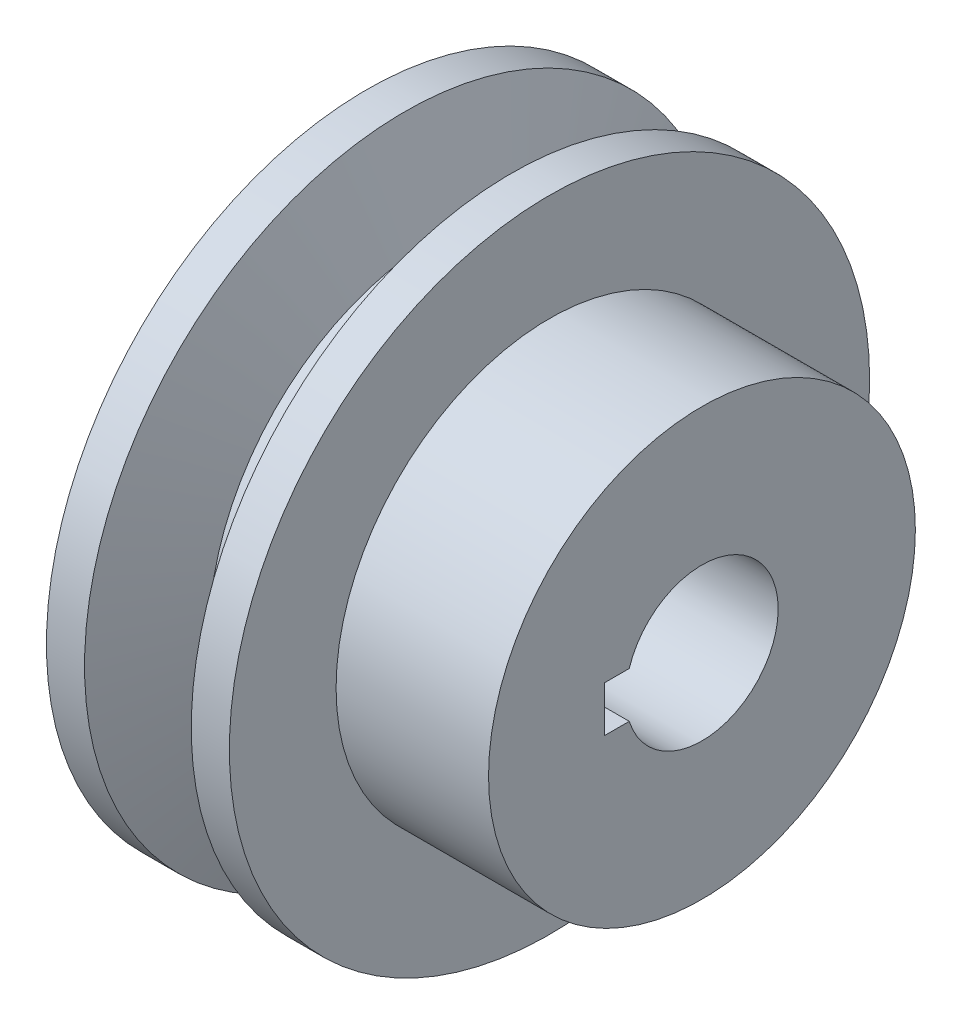
ISO-10303-21;
HEADER;
FILE_DESCRIPTION(('STEP AP214'),'2;1');
FILE_NAME('part.step','',(''),(''),'','','');
FILE_SCHEMA(('AUTOMOTIVE_DESIGN { 1 0 10303 214 1 1 1 1 }'));
ENDSEC;
DATA;
#1=APPLICATION_CONTEXT('core data for automotive mechanical design processes');
#2=APPLICATION_PROTOCOL_DEFINITION('international standard','automotive_design',2000,#1);
#3=PRODUCT_CONTEXT('',#1,'mechanical');
#4=PRODUCT('Part','Part','',(#3));
#5=PRODUCT_RELATED_PRODUCT_CATEGORY('part','',(#4));
#6=PRODUCT_DEFINITION_FORMATION('','',#4);
#7=PRODUCT_DEFINITION_CONTEXT('part definition',#1,'design');
#8=PRODUCT_DEFINITION('design','',#6,#7);
#9=PRODUCT_DEFINITION_SHAPE('','',#8);
#10=(LENGTH_UNIT() NAMED_UNIT(*) SI_UNIT(.MILLI.,.METRE.));
#11=(NAMED_UNIT(*) PLANE_ANGLE_UNIT() SI_UNIT($,.RADIAN.));
#12=(NAMED_UNIT(*) SI_UNIT($,.STERADIAN.) SOLID_ANGLE_UNIT());
#13=UNCERTAINTY_MEASURE_WITH_UNIT(LENGTH_MEASURE(1.E-05),#10,'distance_accuracy_value','');
#14=(GEOMETRIC_REPRESENTATION_CONTEXT(3) GLOBAL_UNCERTAINTY_ASSIGNED_CONTEXT((#13)) GLOBAL_UNIT_ASSIGNED_CONTEXT((#10,
#11,#12)) REPRESENTATION_CONTEXT('',''));
#15=CARTESIAN_POINT('',(0.,0.,0.));
#16=DIRECTION('',(0.,0.,1.));
#17=DIRECTION('',(1.,0.,0.));
#18=AXIS2_PLACEMENT_3D('',#15,#16,#17);
#19=CARTESIAN_POINT('',(22.,14.,0.));
#20=DIRECTION('',(1.,0.,0.));
#21=DIRECTION('',(0.,0.,-1.));
#22=AXIS2_PLACEMENT_3D('',#19,#20,#21);
#23=PLANE('',#22);
#24=DIRECTION('',(0.,0.,-1.));
#25=VECTOR('',#24,1.);
#26=CARTESIAN_POINT('',(22.,1.5,6.4));
#27=LINE('',#26,#25);
#28=CARTESIAN_POINT('',(22.,1.5,6.4));
#29=VERTEX_POINT('',#28);
#30=CARTESIAN_POINT('',(22.,1.5,4.76969600708473));
#31=VERTEX_POINT('',#30);
#32=EDGE_CURVE('E77',#29,#31,#27,.T.);
#33=ORIENTED_EDGE('',*,*,#32,.T.);
#34=CARTESIAN_POINT('',(22.,0.,0.));
#35=DIRECTION('',(-1.,0.,0.));
#36=DIRECTION('',(0.,0.,1.));
#37=AXIS2_PLACEMENT_3D('',#34,#35,#36);
#38=CIRCLE('',#37,5.);
#39=CARTESIAN_POINT('',(22.,-1.5,4.76969600708473));
#40=VERTEX_POINT('',#39);
#41=EDGE_CURVE('E86',#31,#40,#38,.T.);
#42=ORIENTED_EDGE('',*,*,#41,.T.);
#43=DIRECTION('',(0.,0.,1.));
#44=VECTOR('',#43,1.);
#45=CARTESIAN_POINT('',(22.,-1.5,6.4));
#46=LINE('',#45,#44);
#47=CARTESIAN_POINT('',(22.,-1.5,6.4));
#48=VERTEX_POINT('',#47);
#49=EDGE_CURVE('E49',#40,#48,#46,.T.);
#50=ORIENTED_EDGE('',*,*,#49,.T.);
#51=DIRECTION('',(0.,1.,0.));
#52=VECTOR('',#51,1.);
#53=CARTESIAN_POINT('',(22.,1.5,6.4));
#54=LINE('',#53,#52);
#55=EDGE_CURVE('E83',#48,#29,#54,.T.);
#56=ORIENTED_EDGE('',*,*,#55,.T.);
#57=EDGE_LOOP('',(#33,#42,#50,#56));
#58=FACE_BOUND('',#57,.T.);
#59=CARTESIAN_POINT('',(22.,0.,0.));
#60=DIRECTION('',(1.,0.,0.));
#61=DIRECTION('',(0.,0.,-1.));
#62=AXIS2_PLACEMENT_3D('',#59,#60,#61);
#63=CIRCLE('',#62,14.);
#64=CARTESIAN_POINT('',(22.,0.,-14.));
#65=VERTEX_POINT('',#64);
#66=EDGE_CURVE('E107',#65,#65,#63,.T.);
#67=ORIENTED_EDGE('',*,*,#66,.T.);
#68=EDGE_LOOP('',(#67));
#69=FACE_BOUND('',#68,.T.);
#70=ADVANCED_FACE('F35',(#58,#69),#23,.T.);
#71=CARTESIAN_POINT('',(0.,0.,0.));
#72=DIRECTION('',(-1.,0.,0.));
#73=DIRECTION('',(0.,0.,1.));
#74=AXIS2_PLACEMENT_3D('',#71,#72,#73);
#75=PLANE('',#74);
#76=DIRECTION('',(0.,0.,-1.));
#77=VECTOR('',#76,1.);
#78=CARTESIAN_POINT('',(0.,1.5,6.4));
#79=LINE('',#78,#77);
#80=CARTESIAN_POINT('',(0.,1.5,6.4));
#81=VERTEX_POINT('',#80);
#82=CARTESIAN_POINT('',(0.,1.5,4.76969600708473));
#83=VERTEX_POINT('',#82);
#84=EDGE_CURVE('E57',#81,#83,#79,.T.);
#85=ORIENTED_EDGE('',*,*,#84,.F.);
#86=DIRECTION('',(0.,1.,0.));
#87=VECTOR('',#86,1.);
#88=CARTESIAN_POINT('',(0.,1.5,6.4));
#89=LINE('',#88,#87);
#90=CARTESIAN_POINT('',(0.,-1.5,6.4));
#91=VERTEX_POINT('',#90);
#92=EDGE_CURVE('E92',#91,#81,#89,.T.);
#93=ORIENTED_EDGE('',*,*,#92,.F.);
#94=DIRECTION('',(0.,0.,1.));
#95=VECTOR('',#94,1.);
#96=CARTESIAN_POINT('',(0.,-1.5,6.4));
#97=LINE('',#96,#95);
#98=CARTESIAN_POINT('',(0.,-1.5,4.76969600708473));
#99=VERTEX_POINT('',#98);
#100=EDGE_CURVE('E95',#99,#91,#97,.T.);
#101=ORIENTED_EDGE('',*,*,#100,.F.);
#102=CARTESIAN_POINT('',(0.,0.,0.));
#103=DIRECTION('',(-1.,0.,0.));
#104=DIRECTION('',(0.,0.,1.));
#105=AXIS2_PLACEMENT_3D('',#102,#103,#104);
#106=CIRCLE('',#105,5.);
#107=EDGE_CURVE('E101',#83,#99,#106,.T.);
#108=ORIENTED_EDGE('',*,*,#107,.F.);
#109=EDGE_LOOP('',(#85,#93,#101,#108));
#110=FACE_BOUND('',#109,.T.);
#111=CARTESIAN_POINT('',(0.,0.,0.));
#112=DIRECTION('',(1.,0.,0.));
#113=DIRECTION('',(0.,0.,-1.));
#114=AXIS2_PLACEMENT_3D('',#111,#112,#113);
#115=CIRCLE('',#114,21.);
#116=CARTESIAN_POINT('',(0.,0.,-21.));
#117=VERTEX_POINT('',#116);
#118=EDGE_CURVE('E11',#117,#117,#115,.T.);
#119=ORIENTED_EDGE('',*,*,#118,.F.);
#120=EDGE_LOOP('',(#119));
#121=FACE_BOUND('',#120,.T.);
#122=ADVANCED_FACE('F135',(#110,#121),#75,.T.);
#123=CARTESIAN_POINT('',(22.,0.,0.));
#124=DIRECTION('',(1.,0.,0.));
#125=DIRECTION('',(0.,0.,-1.));
#126=AXIS2_PLACEMENT_3D('',#123,#124,#125);
#127=CYLINDRICAL_SURFACE('',#126,21.);
#128=ORIENTED_EDGE('',*,*,#118,.T.);
#129=EDGE_LOOP('',(#128));
#130=FACE_BOUND('',#129,.T.);
#131=CARTESIAN_POINT('',(2.5,0.,0.));
#132=DIRECTION('',(1.,0.,0.));
#133=DIRECTION('',(0.,0.,-1.));
#134=AXIS2_PLACEMENT_3D('',#131,#132,#133);
#135=CIRCLE('',#134,21.);
#136=CARTESIAN_POINT('',(2.5,0.,-21.));
#137=VERTEX_POINT('',#136);
#138=EDGE_CURVE('E42',#137,#137,#135,.T.);
#139=ORIENTED_EDGE('',*,*,#138,.F.);
#140=EDGE_LOOP('',(#139));
#141=FACE_BOUND('',#140,.T.);
#142=ADVANCED_FACE('F133',(#130,#141),#127,.T.);
#143=CARTESIAN_POINT('',(4.6838214055972,0.,0.));
#144=DIRECTION('',(-1.,0.,0.));
#145=DIRECTION('',(0.,0.,1.));
#146=AXIS2_PLACEMENT_3D('',#143,#144,#145);
#147=CONICAL_SURFACE('',#146,15.,1.22173047639603);
#148=ORIENTED_EDGE('',*,*,#138,.T.);
#149=EDGE_LOOP('',(#148));
#150=FACE_BOUND('',#149,.T.);
#151=CARTESIAN_POINT('',(4.6838214055972,0.,0.));
#152=DIRECTION('',(1.,0.,0.));
#153=DIRECTION('',(0.,0.,-1.));
#154=AXIS2_PLACEMENT_3D('',#151,#152,#153);
#155=CIRCLE('',#154,15.);
#156=CARTESIAN_POINT('',(4.6838214055972,0.,-15.));
#157=VERTEX_POINT('',#156);
#158=EDGE_CURVE('E125',#157,#157,#155,.T.);
#159=ORIENTED_EDGE('',*,*,#158,.F.);
#160=EDGE_LOOP('',(#159));
#161=FACE_BOUND('',#160,.T.);
#162=ADVANCED_FACE('F130',(#150,#161),#147,.T.);
#163=CARTESIAN_POINT('',(22.,0.,0.));
#164=DIRECTION('',(1.,0.,0.));
#165=DIRECTION('',(0.,0.,-1.));
#166=AXIS2_PLACEMENT_3D('',#163,#164,#165);
#167=CYLINDRICAL_SURFACE('',#166,15.);
#168=ORIENTED_EDGE('',*,*,#158,.T.);
#169=EDGE_LOOP('',(#168));
#170=FACE_BOUND('',#169,.T.);
#171=CARTESIAN_POINT('',(7.3161785944028,0.,0.));
#172=DIRECTION('',(1.,0.,0.));
#173=DIRECTION('',(0.,0.,-1.));
#174=AXIS2_PLACEMENT_3D('',#171,#172,#173);
#175=CIRCLE('',#174,15.);
#176=CARTESIAN_POINT('',(7.3161785944028,0.,-15.));
#177=VERTEX_POINT('',#176);
#178=EDGE_CURVE('E122',#177,#177,#175,.T.);
#179=ORIENTED_EDGE('',*,*,#178,.F.);
#180=EDGE_LOOP('',(#179));
#181=FACE_BOUND('',#180,.T.);
#182=ADVANCED_FACE('F142',(#170,#181),#167,.T.);
#183=CARTESIAN_POINT('',(9.5,0.,0.));
#184=DIRECTION('',(1.,0.,0.));
#185=DIRECTION('',(0.,0.,-1.));
#186=AXIS2_PLACEMENT_3D('',#183,#184,#185);
#187=CONICAL_SURFACE('',#186,21.,1.22173047639603);
#188=ORIENTED_EDGE('',*,*,#178,.T.);
#189=EDGE_LOOP('',(#188));
#190=FACE_BOUND('',#189,.T.);
#191=CARTESIAN_POINT('',(9.5,0.,0.));
#192=DIRECTION('',(1.,0.,0.));
#193=DIRECTION('',(0.,0.,-1.));
#194=AXIS2_PLACEMENT_3D('',#191,#192,#193);
#195=CIRCLE('',#194,21.);
#196=CARTESIAN_POINT('',(9.5,0.,-21.));
#197=VERTEX_POINT('',#196);
#198=EDGE_CURVE('E119',#197,#197,#195,.T.);
#199=ORIENTED_EDGE('',*,*,#198,.F.);
#200=EDGE_LOOP('',(#199));
#201=FACE_BOUND('',#200,.T.);
#202=ADVANCED_FACE('F206',(#190,#201),#187,.T.);
#203=CARTESIAN_POINT('',(22.,0.,0.));
#204=DIRECTION('',(1.,0.,0.));
#205=DIRECTION('',(0.,0.,-1.));
#206=AXIS2_PLACEMENT_3D('',#203,#204,#205);
#207=CYLINDRICAL_SURFACE('',#206,21.);
#208=ORIENTED_EDGE('',*,*,#198,.T.);
#209=EDGE_LOOP('',(#208));
#210=FACE_BOUND('',#209,.T.);
#211=CARTESIAN_POINT('',(12.,0.,0.));
#212=DIRECTION('',(1.,0.,0.));
#213=DIRECTION('',(0.,0.,-1.));
#214=AXIS2_PLACEMENT_3D('',#211,#212,#213);
#215=CIRCLE('',#214,21.);
#216=CARTESIAN_POINT('',(12.,0.,-21.));
#217=VERTEX_POINT('',#216);
#218=EDGE_CURVE('E116',#217,#217,#215,.T.);
#219=ORIENTED_EDGE('',*,*,#218,.F.);
#220=EDGE_LOOP('',(#219));
#221=FACE_BOUND('',#220,.T.);
#222=ADVANCED_FACE('F202',(#210,#221),#207,.T.);
#223=CARTESIAN_POINT('',(12.,21.,0.));
#224=DIRECTION('',(1.,0.,0.));
#225=DIRECTION('',(0.,0.,-1.));
#226=AXIS2_PLACEMENT_3D('',#223,#224,#225);
#227=PLANE('',#226);
#228=ORIENTED_EDGE('',*,*,#218,.T.);
#229=EDGE_LOOP('',(#228));
#230=FACE_BOUND('',#229,.T.);
#231=CARTESIAN_POINT('',(12.,0.,0.));
#232=DIRECTION('',(1.,0.,0.));
#233=DIRECTION('',(0.,0.,-1.));
#234=AXIS2_PLACEMENT_3D('',#231,#232,#233);
#235=CIRCLE('',#234,14.);
#236=CARTESIAN_POINT('',(12.,0.,-14.));
#237=VERTEX_POINT('',#236);
#238=EDGE_CURVE('E113',#237,#237,#235,.T.);
#239=ORIENTED_EDGE('',*,*,#238,.F.);
#240=EDGE_LOOP('',(#239));
#241=FACE_BOUND('',#240,.T.);
#242=ADVANCED_FACE('F198',(#230,#241),#227,.T.);
#243=CARTESIAN_POINT('',(22.,0.,0.));
#244=DIRECTION('',(1.,0.,0.));
#245=DIRECTION('',(0.,0.,-1.));
#246=AXIS2_PLACEMENT_3D('',#243,#244,#245);
#247=CYLINDRICAL_SURFACE('',#246,14.);
#248=ORIENTED_EDGE('',*,*,#238,.T.);
#249=EDGE_LOOP('',(#248));
#250=FACE_BOUND('',#249,.T.);
#251=ORIENTED_EDGE('',*,*,#66,.F.);
#252=EDGE_LOOP('',(#251));
#253=FACE_BOUND('',#252,.T.);
#254=ADVANCED_FACE('F164',(#250,#253),#247,.T.);
#255=CARTESIAN_POINT('',(22.,1.5,6.4));
#256=DIRECTION('',(0.,1.,0.));
#257=DIRECTION('',(0.,0.,1.));
#258=AXIS2_PLACEMENT_3D('',#255,#256,#257);
#259=PLANE('',#258);
#260=ORIENTED_EDGE('',*,*,#84,.T.);
#261=DIRECTION('',(-1.,0.,0.));
#262=VECTOR('',#261,1.);
#263=CARTESIAN_POINT('',(22.,1.5,4.76969600708473));
#264=LINE('',#263,#262);
#265=EDGE_CURVE('E73',#31,#83,#264,.T.);
#266=ORIENTED_EDGE('',*,*,#265,.F.);
#267=ORIENTED_EDGE('',*,*,#32,.F.);
#268=DIRECTION('',(-1.,0.,0.));
#269=VECTOR('',#268,1.);
#270=CARTESIAN_POINT('',(22.,1.5,6.4));
#271=LINE('',#270,#269);
#272=EDGE_CURVE('E105',#29,#81,#271,.T.);
#273=ORIENTED_EDGE('',*,*,#272,.T.);
#274=EDGE_LOOP('',(#260,#266,#267,#273));
#275=FACE_BOUND('',#274,.T.);
#276=ADVANCED_FACE('F75',(#275),#259,.F.);
#277=CARTESIAN_POINT('',(22.,1.5,6.4));
#278=DIRECTION('',(0.,0.,1.));
#279=DIRECTION('',(1.,0.,0.));
#280=AXIS2_PLACEMENT_3D('',#277,#278,#279);
#281=PLANE('',#280);
#282=ORIENTED_EDGE('',*,*,#92,.T.);
#283=ORIENTED_EDGE('',*,*,#272,.F.);
#284=ORIENTED_EDGE('',*,*,#55,.F.);
#285=DIRECTION('',(-1.,0.,0.));
#286=VECTOR('',#285,1.);
#287=CARTESIAN_POINT('',(22.,-1.5,6.4));
#288=LINE('',#287,#286);
#289=EDGE_CURVE('E108',#48,#91,#288,.T.);
#290=ORIENTED_EDGE('',*,*,#289,.T.);
#291=EDGE_LOOP('',(#282,#283,#284,#290));
#292=FACE_BOUND('',#291,.T.);
#293=ADVANCED_FACE('F163',(#292),#281,.F.);
#294=CARTESIAN_POINT('',(22.,-1.5,6.4));
#295=DIRECTION('',(0.,-1.,0.));
#296=DIRECTION('',(0.,0.,-1.));
#297=AXIS2_PLACEMENT_3D('',#294,#295,#296);
#298=PLANE('',#297);
#299=ORIENTED_EDGE('',*,*,#100,.T.);
#300=ORIENTED_EDGE('',*,*,#289,.F.);
#301=ORIENTED_EDGE('',*,*,#49,.F.);
#302=DIRECTION('',(-1.,0.,0.));
#303=VECTOR('',#302,1.);
#304=CARTESIAN_POINT('',(22.,-1.5,4.76969600708473));
#305=LINE('',#304,#303);
#306=EDGE_CURVE('E82',#40,#99,#305,.T.);
#307=ORIENTED_EDGE('',*,*,#306,.T.);
#308=EDGE_LOOP('',(#299,#300,#301,#307));
#309=FACE_BOUND('',#308,.T.);
#310=ADVANCED_FACE('F175',(#309),#298,.F.);
#311=CARTESIAN_POINT('',(22.,0.,0.));
#312=DIRECTION('',(-1.,0.,0.));
#313=DIRECTION('',(0.,0.,1.));
#314=AXIS2_PLACEMENT_3D('',#311,#312,#313);
#315=CYLINDRICAL_SURFACE('',#314,5.);
#316=ORIENTED_EDGE('',*,*,#107,.T.);
#317=ORIENTED_EDGE('',*,*,#306,.F.);
#318=ORIENTED_EDGE('',*,*,#41,.F.);
#319=ORIENTED_EDGE('',*,*,#265,.T.);
#320=EDGE_LOOP('',(#316,#317,#318,#319));
#321=FACE_BOUND('',#320,.T.);
#322=ADVANCED_FACE('F87',(#321),#315,.F.);
#323=CLOSED_SHELL('',(#70,#122,#142,#162,#182,#202,#222,#242,#254,#276,#293,#310,#322));
#324=MANIFOLD_SOLID_BREP('B2',#323);
#325=ADVANCED_BREP_SHAPE_REPRESENTATION('',(#18,#324),#14);
#326=SHAPE_DEFINITION_REPRESENTATION(#9,#325);
ENDSEC;
END-ISO-10303-21;
